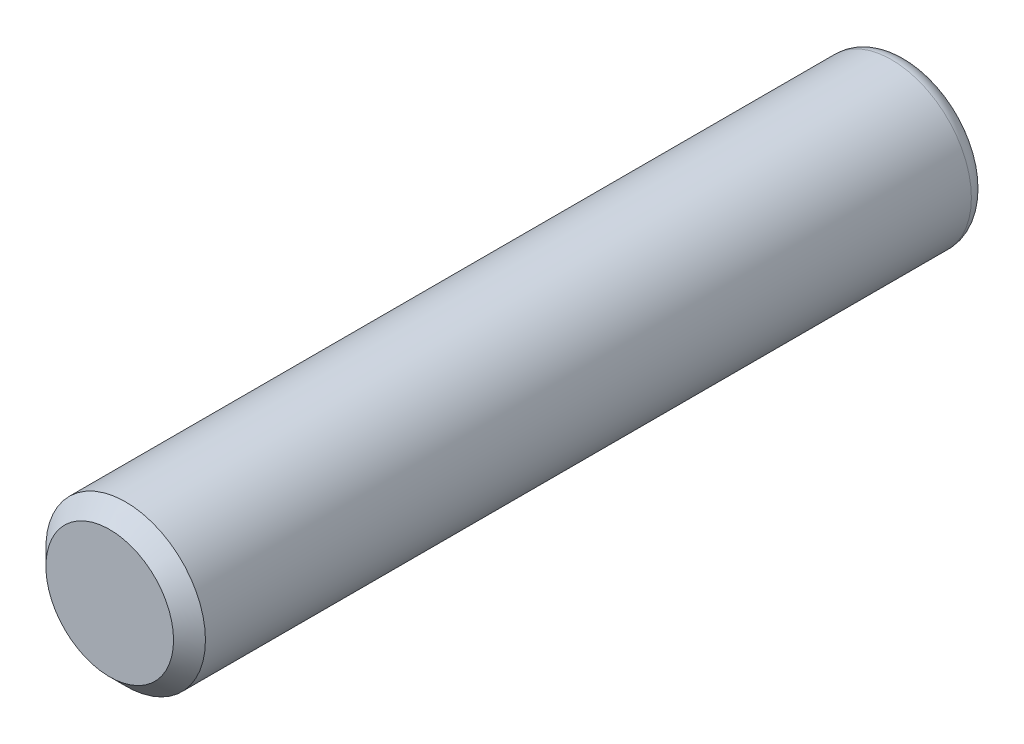
ISO-10303-21;
HEADER;
FILE_DESCRIPTION(('STEP AP214'),'2;1');
FILE_NAME('part.step','',(''),(''),'','','');
FILE_SCHEMA(('AUTOMOTIVE_DESIGN { 1 0 10303 214 1 1 1 1 }'));
ENDSEC;
DATA;
#1=APPLICATION_CONTEXT('core data for automotive mechanical design processes');
#2=APPLICATION_PROTOCOL_DEFINITION('international standard','automotive_design',2000,#1);
#3=PRODUCT_CONTEXT('',#1,'mechanical');
#4=PRODUCT('Part','Part','',(#3));
#5=PRODUCT_RELATED_PRODUCT_CATEGORY('part','',(#4));
#6=PRODUCT_DEFINITION_FORMATION('','',#4);
#7=PRODUCT_DEFINITION_CONTEXT('part definition',#1,'design');
#8=PRODUCT_DEFINITION('design','',#6,#7);
#9=PRODUCT_DEFINITION_SHAPE('','',#8);
#10=(LENGTH_UNIT() NAMED_UNIT(*) SI_UNIT(.MILLI.,.METRE.));
#11=(NAMED_UNIT(*) PLANE_ANGLE_UNIT() SI_UNIT($,.RADIAN.));
#12=(NAMED_UNIT(*) SI_UNIT($,.STERADIAN.) SOLID_ANGLE_UNIT());
#13=UNCERTAINTY_MEASURE_WITH_UNIT(LENGTH_MEASURE(1.E-05),#10,'distance_accuracy_value','');
#14=(GEOMETRIC_REPRESENTATION_CONTEXT(3) GLOBAL_UNCERTAINTY_ASSIGNED_CONTEXT((#13)) GLOBAL_UNIT_ASSIGNED_CONTEXT((#10,
#11,#12)) REPRESENTATION_CONTEXT('',''));
#15=CARTESIAN_POINT('',(0.,0.,0.));
#16=DIRECTION('',(0.,0.,1.));
#17=DIRECTION('',(1.,0.,0.));
#18=AXIS2_PLACEMENT_3D('',#15,#16,#17);
#19=CARTESIAN_POINT('',(0.,0.,-7.62));
#20=DIRECTION('',(0.,0.,1.));
#21=DIRECTION('',(1.,0.,0.));
#22=AXIS2_PLACEMENT_3D('',#19,#20,#21);
#23=TOROIDAL_SURFACE('',#22,1.27,0.3175);
#24=CARTESIAN_POINT('',(0.,0.,-7.62));
#25=DIRECTION('',(0.,0.,1.));
#26=DIRECTION('',(1.,0.,0.));
#27=AXIS2_PLACEMENT_3D('',#24,#25,#26);
#28=CIRCLE('',#27,1.5875);
#29=CARTESIAN_POINT('',(1.5875,0.,-7.62));
#30=VERTEX_POINT('',#29);
#31=EDGE_CURVE('E10',#30,#30,#28,.T.);
#32=ORIENTED_EDGE('',*,*,#31,.F.);
#33=EDGE_LOOP('',(#32));
#34=FACE_BOUND('',#33,.T.);
#35=CARTESIAN_POINT('',(0.,0.,-7.9375));
#36=DIRECTION('',(0.,0.,1.));
#37=DIRECTION('',(1.,0.,0.));
#38=AXIS2_PLACEMENT_3D('',#35,#36,#37);
#39=CIRCLE('',#38,1.27);
#40=CARTESIAN_POINT('',(1.27,0.,-7.9375));
#41=VERTEX_POINT('',#40);
#42=EDGE_CURVE('E46',#41,#41,#39,.T.);
#43=ORIENTED_EDGE('',*,*,#42,.T.);
#44=EDGE_LOOP('',(#43));
#45=FACE_BOUND('',#44,.T.);
#46=ADVANCED_FACE('F32',(#34,#45),#23,.T.);
#47=CARTESIAN_POINT('',(0.,0.,7.9375));
#48=DIRECTION('',(0.,0.,1.));
#49=DIRECTION('',(1.,0.,0.));
#50=AXIS2_PLACEMENT_3D('',#47,#48,#49);
#51=CYLINDRICAL_SURFACE('',#50,1.5875);
#52=CARTESIAN_POINT('',(0.,0.,7.62));
#53=DIRECTION('',(0.,0.,1.));
#54=DIRECTION('',(1.,0.,0.));
#55=AXIS2_PLACEMENT_3D('',#52,#53,#54);
#56=CIRCLE('',#55,1.5875);
#57=CARTESIAN_POINT('',(1.5875,0.,7.62));
#58=VERTEX_POINT('',#57);
#59=EDGE_CURVE('E38',#58,#58,#56,.T.);
#60=ORIENTED_EDGE('',*,*,#59,.F.);
#61=EDGE_LOOP('',(#60));
#62=FACE_BOUND('',#61,.T.);
#63=ORIENTED_EDGE('',*,*,#31,.T.);
#64=EDGE_LOOP('',(#63));
#65=FACE_BOUND('',#64,.T.);
#66=ADVANCED_FACE('F64',(#62,#65),#51,.T.);
#67=CARTESIAN_POINT('',(0.,0.,7.62));
#68=DIRECTION('',(0.,0.,-1.));
#69=DIRECTION('',(-1.,0.,0.));
#70=AXIS2_PLACEMENT_3D('',#67,#68,#69);
#71=CONICAL_SURFACE('',#70,1.5875,0.785398163397448);
#72=CARTESIAN_POINT('',(0.,0.,7.9375));
#73=DIRECTION('',(0.,0.,1.));
#74=DIRECTION('',(1.,0.,0.));
#75=AXIS2_PLACEMENT_3D('',#72,#73,#74);
#76=CIRCLE('',#75,1.27);
#77=CARTESIAN_POINT('',(1.27,0.,7.9375));
#78=VERTEX_POINT('',#77);
#79=EDGE_CURVE('E42',#78,#78,#76,.T.);
#80=ORIENTED_EDGE('',*,*,#79,.F.);
#81=EDGE_LOOP('',(#80));
#82=FACE_BOUND('',#81,.T.);
#83=ORIENTED_EDGE('',*,*,#59,.T.);
#84=EDGE_LOOP('',(#83));
#85=FACE_BOUND('',#84,.T.);
#86=ADVANCED_FACE('F60',(#82,#85),#71,.T.);
#87=CARTESIAN_POINT('',(0.,0.,7.9375));
#88=DIRECTION('',(0.,0.,-1.));
#89=DIRECTION('',(-1.,0.,0.));
#90=AXIS2_PLACEMENT_3D('',#87,#88,#89);
#91=PLANE('',#90);
#92=ORIENTED_EDGE('',*,*,#79,.T.);
#93=EDGE_LOOP('',(#92));
#94=FACE_BOUND('',#93,.T.);
#95=ADVANCED_FACE('F55',(#94),#91,.F.);
#96=CARTESIAN_POINT('',(0.,1.27,-7.9375));
#97=DIRECTION('',(0.,0.,1.));
#98=DIRECTION('',(1.,0.,0.));
#99=AXIS2_PLACEMENT_3D('',#96,#97,#98);
#100=PLANE('',#99);
#101=ORIENTED_EDGE('',*,*,#42,.F.);
#102=EDGE_LOOP('',(#101));
#103=FACE_BOUND('',#102,.T.);
#104=ADVANCED_FACE('F53',(#103),#100,.F.);
#105=CLOSED_SHELL('',(#46,#66,#86,#95,#104));
#106=MANIFOLD_SOLID_BREP('B2',#105);
#107=ADVANCED_BREP_SHAPE_REPRESENTATION('',(#18,#106),#14);
#108=SHAPE_DEFINITION_REPRESENTATION(#9,#107);
ENDSEC;
END-ISO-10303-21;
